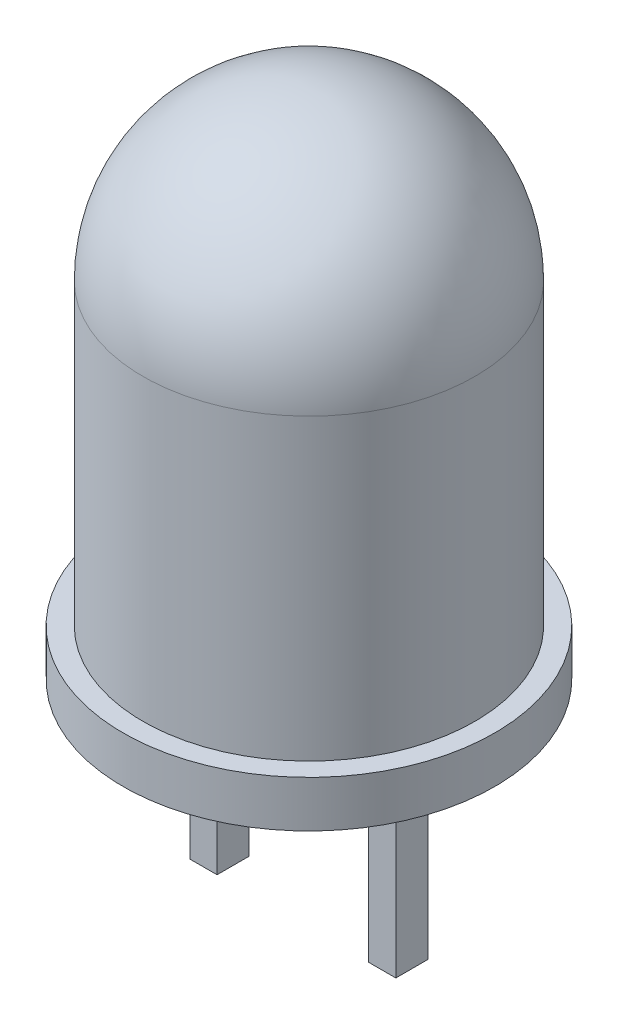
ISO-10303-21;
HEADER;
FILE_DESCRIPTION(('STEP AP214'),'2;1');
FILE_NAME('part.step','',(''),(''),'','','');
FILE_SCHEMA(('AUTOMOTIVE_DESIGN { 1 0 10303 214 1 1 1 1 }'));
ENDSEC;
DATA;
#1=APPLICATION_CONTEXT('core data for automotive mechanical design processes');
#2=APPLICATION_PROTOCOL_DEFINITION('international standard','automotive_design',2000,#1);
#3=PRODUCT_CONTEXT('',#1,'mechanical');
#4=PRODUCT('Part','Part','',(#3));
#5=PRODUCT_RELATED_PRODUCT_CATEGORY('part','',(#4));
#6=PRODUCT_DEFINITION_FORMATION('','',#4);
#7=PRODUCT_DEFINITION_CONTEXT('part definition',#1,'design');
#8=PRODUCT_DEFINITION('design','',#6,#7);
#9=PRODUCT_DEFINITION_SHAPE('','',#8);
#10=(LENGTH_UNIT() NAMED_UNIT(*) SI_UNIT(.MILLI.,.METRE.));
#11=(NAMED_UNIT(*) PLANE_ANGLE_UNIT() SI_UNIT($,.RADIAN.));
#12=(NAMED_UNIT(*) SI_UNIT($,.STERADIAN.) SOLID_ANGLE_UNIT());
#13=UNCERTAINTY_MEASURE_WITH_UNIT(LENGTH_MEASURE(1.E-05),#10,'distance_accuracy_value','');
#14=(GEOMETRIC_REPRESENTATION_CONTEXT(3) GLOBAL_UNCERTAINTY_ASSIGNED_CONTEXT((#13)) GLOBAL_UNIT_ASSIGNED_CONTEXT((#10,
#11,#12)) REPRESENTATION_CONTEXT('',''));
#15=CARTESIAN_POINT('',(0.,0.,0.));
#16=DIRECTION('',(0.,0.,1.));
#17=DIRECTION('',(1.,0.,0.));
#18=AXIS2_PLACEMENT_3D('',#15,#16,#17);
#19=CARTESIAN_POINT('',(0.,-0.7,0.));
#20=DIRECTION('',(0.,-1.,0.));
#21=DIRECTION('',(0.,0.,-1.));
#22=AXIS2_PLACEMENT_3D('',#19,#20,#21);
#23=PLANE('',#22);
#24=DIRECTION('',(-1.,0.,0.));
#25=VECTOR('',#24,1.);
#26=CARTESIAN_POINT('',(1.14190313671731,-0.7,0.242385099774928));
#27=LINE('',#26,#25);
#28=CARTESIAN_POINT('',(1.55126463855937,-0.7,0.242385099774928));
#29=VERTEX_POINT('',#28);
#30=CARTESIAN_POINT('',(1.14190313671731,-0.7,0.242385099774928));
#31=VERTEX_POINT('',#30);
#32=EDGE_CURVE('E129',#29,#31,#27,.T.);
#33=ORIENTED_EDGE('',*,*,#32,.F.);
#34=DIRECTION('',(0.,0.,1.));
#35=VECTOR('',#34,1.);
#36=CARTESIAN_POINT('',(1.55126463855937,-0.7,-0.242385099774928));
#37=LINE('',#36,#35);
#38=CARTESIAN_POINT('',(1.55126463855937,-0.7,-0.242385099774928));
#39=VERTEX_POINT('',#38);
#40=EDGE_CURVE('E126',#39,#29,#37,.T.);
#41=ORIENTED_EDGE('',*,*,#40,.F.);
#42=DIRECTION('',(1.,0.,0.));
#43=VECTOR('',#42,1.);
#44=CARTESIAN_POINT('',(1.14190313671731,-0.7,-0.242385099774928));
#45=LINE('',#44,#43);
#46=CARTESIAN_POINT('',(1.14190313671731,-0.7,-0.242385099774928));
#47=VERTEX_POINT('',#46);
#48=EDGE_CURVE('E138',#47,#39,#45,.T.);
#49=ORIENTED_EDGE('',*,*,#48,.F.);
#50=DIRECTION('',(0.,0.,-1.));
#51=VECTOR('',#50,1.);
#52=CARTESIAN_POINT('',(1.14190313671731,-0.7,-0.242385099774928));
#53=LINE('',#52,#51);
#54=EDGE_CURVE('E146',#31,#47,#53,.T.);
#55=ORIENTED_EDGE('',*,*,#54,.F.);
#56=EDGE_LOOP('',(#33,#41,#49,#55));
#57=FACE_BOUND('',#56,.T.);
#58=CARTESIAN_POINT('',(0.,-0.7,0.));
#59=DIRECTION('',(0.,-1.,0.));
#60=DIRECTION('',(0.,0.,-1.));
#61=AXIS2_PLACEMENT_3D('',#58,#59,#60);
#62=CIRCLE('',#61,2.8);
#63=CARTESIAN_POINT('',(0.,-0.7,-2.8));
#64=VERTEX_POINT('',#63);
#65=EDGE_CURVE('E158',#64,#64,#62,.T.);
#66=ORIENTED_EDGE('',*,*,#65,.T.);
#67=EDGE_LOOP('',(#66));
#68=FACE_BOUND('',#67,.T.);
#69=DIRECTION('',(-1.,0.,0.));
#70=VECTOR('',#69,1.);
#71=CARTESIAN_POINT('',(-1.14190313671731,-0.7,0.242385099774928));
#72=LINE('',#71,#70);
#73=CARTESIAN_POINT('',(-1.14190313671731,-0.7,0.242385099774928));
#74=VERTEX_POINT('',#73);
#75=CARTESIAN_POINT('',(-1.55126463855937,-0.7,0.242385099774928));
#76=VERTEX_POINT('',#75);
#77=EDGE_CURVE('E312',#74,#76,#72,.T.);
#78=ORIENTED_EDGE('',*,*,#77,.F.);
#79=DIRECTION('',(0.,0.,1.));
#80=VECTOR('',#79,1.);
#81=CARTESIAN_POINT('',(-1.14190313671731,-0.7,-0.242385099774928));
#82=LINE('',#81,#80);
#83=CARTESIAN_POINT('',(-1.14190313671731,-0.7,-0.242385099774928));
#84=VERTEX_POINT('',#83);
#85=EDGE_CURVE('E124',#84,#74,#82,.T.);
#86=ORIENTED_EDGE('',*,*,#85,.F.);
#87=DIRECTION('',(1.,0.,0.));
#88=VECTOR('',#87,1.);
#89=CARTESIAN_POINT('',(-1.14190313671731,-0.7,-0.242385099774928));
#90=LINE('',#89,#88);
#91=CARTESIAN_POINT('',(-1.55126463855937,-0.7,-0.242385099774928));
#92=VERTEX_POINT('',#91);
#93=EDGE_CURVE('E120',#92,#84,#90,.T.);
#94=ORIENTED_EDGE('',*,*,#93,.F.);
#95=DIRECTION('',(0.,0.,-1.));
#96=VECTOR('',#95,1.);
#97=CARTESIAN_POINT('',(-1.55126463855937,-0.7,-0.242385099774928));
#98=LINE('',#97,#96);
#99=EDGE_CURVE('E309',#76,#92,#98,.T.);
#100=ORIENTED_EDGE('',*,*,#99,.F.);
#101=EDGE_LOOP('',(#78,#86,#94,#100));
#102=FACE_BOUND('',#101,.T.);
#103=ADVANCED_FACE('F35',(#57,#68,#102),#23,.T.);
#104=CARTESIAN_POINT('',(0.,7.,0.));
#105=DIRECTION('',(0.,-1.,0.));
#106=DIRECTION('',(0.,0.,-1.));
#107=AXIS2_PLACEMENT_3D('',#104,#105,#106);
#108=CYLINDRICAL_SURFACE('',#107,2.5);
#109=CARTESIAN_POINT('',(0.,4.5,0.));
#110=DIRECTION('',(0.,-1.,0.));
#111=DIRECTION('',(0.,0.,-1.));
#112=AXIS2_PLACEMENT_3D('',#109,#110,#111);
#113=CIRCLE('',#112,2.5);
#114=CARTESIAN_POINT('',(0.,4.5,-2.5));
#115=VERTEX_POINT('',#114);
#116=EDGE_CURVE('E11',#115,#115,#113,.T.);
#117=ORIENTED_EDGE('',*,*,#116,.T.);
#118=EDGE_LOOP('',(#117));
#119=FACE_BOUND('',#118,.T.);
#120=CARTESIAN_POINT('',(0.,0.,0.));
#121=DIRECTION('',(0.,-1.,0.));
#122=DIRECTION('',(0.,0.,-1.));
#123=AXIS2_PLACEMENT_3D('',#120,#121,#122);
#124=CIRCLE('',#123,2.5);
#125=CARTESIAN_POINT('',(0.,0.,-2.5));
#126=VERTEX_POINT('',#125);
#127=EDGE_CURVE('E43',#126,#126,#124,.T.);
#128=ORIENTED_EDGE('',*,*,#127,.F.);
#129=EDGE_LOOP('',(#128));
#130=FACE_BOUND('',#129,.T.);
#131=ADVANCED_FACE('F167',(#119,#130),#108,.T.);
#132=CARTESIAN_POINT('',(0.,0.,0.));
#133=DIRECTION('',(0.,-1.,0.));
#134=DIRECTION('',(0.,0.,-1.));
#135=AXIS2_PLACEMENT_3D('',#132,#133,#134);
#136=PLANE('',#135);
#137=CARTESIAN_POINT('',(0.,0.,0.));
#138=DIRECTION('',(0.,-1.,0.));
#139=DIRECTION('',(0.,0.,-1.));
#140=AXIS2_PLACEMENT_3D('',#137,#138,#139);
#141=CIRCLE('',#140,2.8);
#142=CARTESIAN_POINT('',(0.,0.,-2.8));
#143=VERTEX_POINT('',#142);
#144=EDGE_CURVE('E157',#143,#143,#141,.T.);
#145=ORIENTED_EDGE('',*,*,#144,.F.);
#146=EDGE_LOOP('',(#145));
#147=FACE_BOUND('',#146,.T.);
#148=ORIENTED_EDGE('',*,*,#127,.T.);
#149=EDGE_LOOP('',(#148));
#150=FACE_BOUND('',#149,.T.);
#151=ADVANCED_FACE('F165',(#147,#150),#136,.F.);
#152=CARTESIAN_POINT('',(0.,-0.7,0.));
#153=DIRECTION('',(0.,1.,0.));
#154=DIRECTION('',(0.,0.,1.));
#155=AXIS2_PLACEMENT_3D('',#152,#153,#154);
#156=CYLINDRICAL_SURFACE('',#155,2.8);
#157=ORIENTED_EDGE('',*,*,#65,.F.);
#158=EDGE_LOOP('',(#157));
#159=FACE_BOUND('',#158,.T.);
#160=ORIENTED_EDGE('',*,*,#144,.T.);
#161=EDGE_LOOP('',(#160));
#162=FACE_BOUND('',#161,.T.);
#163=ADVANCED_FACE('F174',(#159,#162),#156,.T.);
#164=CARTESIAN_POINT('',(0.,4.5,0.));
#165=DIRECTION('',(0.,0.,1.));
#166=DIRECTION('',(1.,0.,0.));
#167=AXIS2_PLACEMENT_3D('',#164,#165,#166);
#168=SPHERICAL_SURFACE('',#167,2.5);
#169=CARTESIAN_POINT('',(0.,4.5,0.));
#170=DIRECTION('',(0.,-1.,0.));
#171=DIRECTION('',(0.,0.,-1.));
#172=AXIS2_PLACEMENT_3D('',#169,#170,#171);
#173=SPHERICAL_SURFACE('',#172,2.5);
#174=ORIENTED_EDGE('',*,*,#116,.F.);
#175=EDGE_LOOP('',(#174));
#176=FACE_BOUND('',#175,.T.);
#177=ADVANCED_FACE('F37',(#176),#173,.T.);
#178=CARTESIAN_POINT('',(1.55126463855937,-3.7,-0.242385099774928));
#179=DIRECTION('',(-1.,0.,0.));
#180=DIRECTION('',(0.,0.,1.));
#181=AXIS2_PLACEMENT_3D('',#178,#179,#180);
#182=PLANE('',#181);
#183=ORIENTED_EDGE('',*,*,#40,.T.);
#184=DIRECTION('',(0.,1.,0.));
#185=VECTOR('',#184,1.);
#186=CARTESIAN_POINT('',(1.55126463855937,-3.7,0.242385099774928));
#187=LINE('',#186,#185);
#188=CARTESIAN_POINT('',(1.55126463855937,-3.7,0.242385099774928));
#189=VERTEX_POINT('',#188);
#190=EDGE_CURVE('E155',#189,#29,#187,.T.);
#191=ORIENTED_EDGE('',*,*,#190,.F.);
#192=DIRECTION('',(0.,0.,1.));
#193=VECTOR('',#192,1.);
#194=CARTESIAN_POINT('',(1.55126463855937,-3.7,-0.242385099774928));
#195=LINE('',#194,#193);
#196=CARTESIAN_POINT('',(1.55126463855937,-3.7,-0.242385099774928));
#197=VERTEX_POINT('',#196);
#198=EDGE_CURVE('E134',#197,#189,#195,.T.);
#199=ORIENTED_EDGE('',*,*,#198,.F.);
#200=DIRECTION('',(0.,1.,0.));
#201=VECTOR('',#200,1.);
#202=CARTESIAN_POINT('',(1.55126463855937,-3.7,-0.242385099774928));
#203=LINE('',#202,#201);
#204=EDGE_CURVE('E143',#197,#39,#203,.T.);
#205=ORIENTED_EDGE('',*,*,#204,.T.);
#206=EDGE_LOOP('',(#183,#191,#199,#205));
#207=FACE_BOUND('',#206,.T.);
#208=ADVANCED_FACE('F183',(#207),#182,.F.);
#209=CARTESIAN_POINT('',(1.14190313671731,-3.7,0.242385099774928));
#210=DIRECTION('',(0.,0.,-1.));
#211=DIRECTION('',(-1.,0.,0.));
#212=AXIS2_PLACEMENT_3D('',#209,#210,#211);
#213=PLANE('',#212);
#214=ORIENTED_EDGE('',*,*,#32,.T.);
#215=DIRECTION('',(0.,1.,0.));
#216=VECTOR('',#215,1.);
#217=CARTESIAN_POINT('',(1.14190313671731,-3.7,0.242385099774928));
#218=LINE('',#217,#216);
#219=CARTESIAN_POINT('',(1.14190313671731,-3.7,0.242385099774928));
#220=VERTEX_POINT('',#219);
#221=EDGE_CURVE('E152',#220,#31,#218,.T.);
#222=ORIENTED_EDGE('',*,*,#221,.F.);
#223=DIRECTION('',(-1.,0.,0.));
#224=VECTOR('',#223,1.);
#225=CARTESIAN_POINT('',(1.14190313671731,-3.7,0.242385099774928));
#226=LINE('',#225,#224);
#227=EDGE_CURVE('E137',#189,#220,#226,.T.);
#228=ORIENTED_EDGE('',*,*,#227,.F.);
#229=ORIENTED_EDGE('',*,*,#190,.T.);
#230=EDGE_LOOP('',(#214,#222,#228,#229));
#231=FACE_BOUND('',#230,.T.);
#232=ADVANCED_FACE('F186',(#231),#213,.F.);
#233=CARTESIAN_POINT('',(1.14190313671731,-3.7,-0.242385099774928));
#234=DIRECTION('',(1.,0.,0.));
#235=DIRECTION('',(0.,0.,-1.));
#236=AXIS2_PLACEMENT_3D('',#233,#234,#235);
#237=PLANE('',#236);
#238=ORIENTED_EDGE('',*,*,#54,.T.);
#239=DIRECTION('',(0.,1.,0.));
#240=VECTOR('',#239,1.);
#241=CARTESIAN_POINT('',(1.14190313671731,-3.7,-0.242385099774928));
#242=LINE('',#241,#240);
#243=CARTESIAN_POINT('',(1.14190313671731,-3.7,-0.242385099774928));
#244=VERTEX_POINT('',#243);
#245=EDGE_CURVE('E58',#244,#47,#242,.T.);
#246=ORIENTED_EDGE('',*,*,#245,.F.);
#247=DIRECTION('',(0.,0.,-1.));
#248=VECTOR('',#247,1.);
#249=CARTESIAN_POINT('',(1.14190313671731,-3.7,-0.242385099774928));
#250=LINE('',#249,#248);
#251=EDGE_CURVE('E140',#220,#244,#250,.T.);
#252=ORIENTED_EDGE('',*,*,#251,.F.);
#253=ORIENTED_EDGE('',*,*,#221,.T.);
#254=EDGE_LOOP('',(#238,#246,#252,#253));
#255=FACE_BOUND('',#254,.T.);
#256=ADVANCED_FACE('F190',(#255),#237,.F.);
#257=CARTESIAN_POINT('',(1.14190313671731,-3.7,-0.242385099774928));
#258=DIRECTION('',(0.,0.,1.));
#259=DIRECTION('',(1.,0.,0.));
#260=AXIS2_PLACEMENT_3D('',#257,#258,#259);
#261=PLANE('',#260);
#262=ORIENTED_EDGE('',*,*,#48,.T.);
#263=ORIENTED_EDGE('',*,*,#204,.F.);
#264=DIRECTION('',(1.,0.,0.));
#265=VECTOR('',#264,1.);
#266=CARTESIAN_POINT('',(1.14190313671731,-3.7,-0.242385099774928));
#267=LINE('',#266,#265);
#268=EDGE_CURVE('E142',#244,#197,#267,.T.);
#269=ORIENTED_EDGE('',*,*,#268,.F.);
#270=ORIENTED_EDGE('',*,*,#245,.T.);
#271=EDGE_LOOP('',(#262,#263,#269,#270));
#272=FACE_BOUND('',#271,.T.);
#273=ADVANCED_FACE('F194',(#272),#261,.F.);
#274=CARTESIAN_POINT('',(1.55126463855937,-3.7,0.242385099774928));
#275=DIRECTION('',(0.,1.,0.));
#276=DIRECTION('',(0.,0.,1.));
#277=AXIS2_PLACEMENT_3D('',#274,#275,#276);
#278=PLANE('',#277);
#279=ORIENTED_EDGE('',*,*,#198,.T.);
#280=ORIENTED_EDGE('',*,*,#227,.T.);
#281=ORIENTED_EDGE('',*,*,#251,.T.);
#282=ORIENTED_EDGE('',*,*,#268,.T.);
#283=EDGE_LOOP('',(#279,#280,#281,#282));
#284=FACE_BOUND('',#283,.T.);
#285=ADVANCED_FACE('F198',(#284),#278,.F.);
#286=CARTESIAN_POINT('',(-1.14190313671731,-3.7,-0.242385099774928));
#287=DIRECTION('',(-1.,0.,0.));
#288=DIRECTION('',(0.,0.,1.));
#289=AXIS2_PLACEMENT_3D('',#286,#287,#288);
#290=PLANE('',#289);
#291=ORIENTED_EDGE('',*,*,#85,.T.);
#292=DIRECTION('',(0.,1.,0.));
#293=VECTOR('',#292,1.);
#294=CARTESIAN_POINT('',(-1.14190313671731,-3.7,0.242385099774928));
#295=LINE('',#294,#293);
#296=CARTESIAN_POINT('',(-1.14190313671731,-3.7,0.242385099774928));
#297=VERTEX_POINT('',#296);
#298=EDGE_CURVE('E105',#297,#74,#295,.T.);
#299=ORIENTED_EDGE('',*,*,#298,.F.);
#300=DIRECTION('',(0.,0.,1.));
#301=VECTOR('',#300,1.);
#302=CARTESIAN_POINT('',(-1.14190313671731,-3.7,-0.242385099774928));
#303=LINE('',#302,#301);
#304=CARTESIAN_POINT('',(-1.14190313671731,-3.7,-0.242385099774928));
#305=VERTEX_POINT('',#304);
#306=EDGE_CURVE('E112',#305,#297,#303,.T.);
#307=ORIENTED_EDGE('',*,*,#306,.F.);
#308=DIRECTION('',(0.,1.,0.));
#309=VECTOR('',#308,1.);
#310=CARTESIAN_POINT('',(-1.14190313671731,-3.7,-0.242385099774928));
#311=LINE('',#310,#309);
#312=EDGE_CURVE('E306',#305,#84,#311,.T.);
#313=ORIENTED_EDGE('',*,*,#312,.T.);
#314=EDGE_LOOP('',(#291,#299,#307,#313));
#315=FACE_BOUND('',#314,.T.);
#316=ADVANCED_FACE('F122',(#315),#290,.F.);
#317=CARTESIAN_POINT('',(-1.14190313671731,-3.7,0.242385099774928));
#318=DIRECTION('',(0.,0.,-1.));
#319=DIRECTION('',(-1.,0.,0.));
#320=AXIS2_PLACEMENT_3D('',#317,#318,#319);
#321=PLANE('',#320);
#322=ORIENTED_EDGE('',*,*,#77,.T.);
#323=DIRECTION('',(0.,1.,0.));
#324=VECTOR('',#323,1.);
#325=CARTESIAN_POINT('',(-1.55126463855937,-3.7,0.242385099774928));
#326=LINE('',#325,#324);
#327=CARTESIAN_POINT('',(-1.55126463855937,-3.7,0.242385099774928));
#328=VERTEX_POINT('',#327);
#329=EDGE_CURVE('E108',#328,#76,#326,.T.);
#330=ORIENTED_EDGE('',*,*,#329,.F.);
#331=DIRECTION('',(-1.,0.,0.));
#332=VECTOR('',#331,1.);
#333=CARTESIAN_POINT('',(-1.14190313671731,-3.7,0.242385099774928));
#334=LINE('',#333,#332);
#335=EDGE_CURVE('E101',#297,#328,#334,.T.);
#336=ORIENTED_EDGE('',*,*,#335,.F.);
#337=ORIENTED_EDGE('',*,*,#298,.T.);
#338=EDGE_LOOP('',(#322,#330,#336,#337));
#339=FACE_BOUND('',#338,.T.);
#340=ADVANCED_FACE('F103',(#339),#321,.F.);
#341=CARTESIAN_POINT('',(-1.55126463855937,-3.7,-0.242385099774928));
#342=DIRECTION('',(1.,0.,0.));
#343=DIRECTION('',(0.,0.,-1.));
#344=AXIS2_PLACEMENT_3D('',#341,#342,#343);
#345=PLANE('',#344);
#346=ORIENTED_EDGE('',*,*,#99,.T.);
#347=DIRECTION('',(0.,1.,0.));
#348=VECTOR('',#347,1.);
#349=CARTESIAN_POINT('',(-1.55126463855937,-3.7,-0.242385099774928));
#350=LINE('',#349,#348);
#351=CARTESIAN_POINT('',(-1.55126463855937,-3.7,-0.242385099774928));
#352=VERTEX_POINT('',#351);
#353=EDGE_CURVE('E50',#352,#92,#350,.T.);
#354=ORIENTED_EDGE('',*,*,#353,.F.);
#355=DIRECTION('',(0.,0.,-1.));
#356=VECTOR('',#355,1.);
#357=CARTESIAN_POINT('',(-1.55126463855937,-3.7,-0.242385099774928));
#358=LINE('',#357,#356);
#359=EDGE_CURVE('E111',#328,#352,#358,.T.);
#360=ORIENTED_EDGE('',*,*,#359,.F.);
#361=ORIENTED_EDGE('',*,*,#329,.T.);
#362=EDGE_LOOP('',(#346,#354,#360,#361));
#363=FACE_BOUND('',#362,.T.);
#364=ADVANCED_FACE('F206',(#363),#345,.F.);
#365=CARTESIAN_POINT('',(-1.14190313671731,-3.7,-0.242385099774928));
#366=DIRECTION('',(0.,0.,1.));
#367=DIRECTION('',(1.,0.,0.));
#368=AXIS2_PLACEMENT_3D('',#365,#366,#367);
#369=PLANE('',#368);
#370=ORIENTED_EDGE('',*,*,#93,.T.);
#371=ORIENTED_EDGE('',*,*,#312,.F.);
#372=DIRECTION('',(1.,0.,0.));
#373=VECTOR('',#372,1.);
#374=CARTESIAN_POINT('',(-1.14190313671731,-3.7,-0.242385099774928));
#375=LINE('',#374,#373);
#376=EDGE_CURVE('E116',#352,#305,#375,.T.);
#377=ORIENTED_EDGE('',*,*,#376,.F.);
#378=ORIENTED_EDGE('',*,*,#353,.T.);
#379=EDGE_LOOP('',(#370,#371,#377,#378));
#380=FACE_BOUND('',#379,.T.);
#381=ADVANCED_FACE('F209',(#380),#369,.F.);
#382=CARTESIAN_POINT('',(-1.14190313671731,-3.7,0.242385099774928));
#383=DIRECTION('',(0.,-1.,0.));
#384=DIRECTION('',(0.,0.,-1.));
#385=AXIS2_PLACEMENT_3D('',#382,#383,#384);
#386=PLANE('',#385);
#387=ORIENTED_EDGE('',*,*,#306,.T.);
#388=ORIENTED_EDGE('',*,*,#335,.T.);
#389=ORIENTED_EDGE('',*,*,#359,.T.);
#390=ORIENTED_EDGE('',*,*,#376,.T.);
#391=EDGE_LOOP('',(#387,#388,#389,#390));
#392=FACE_BOUND('',#391,.T.);
#393=ADVANCED_FACE('F115',(#392),#386,.T.);
#394=CLOSED_SHELL('',(#103,#131,#151,#163,#177,#208,#232,#256,#273,#285,#316,#340,#364,#381,#393));
#395=MANIFOLD_SOLID_BREP('B2',#394);
#396=ADVANCED_BREP_SHAPE_REPRESENTATION('',(#18,#395),#14);
#397=SHAPE_DEFINITION_REPRESENTATION(#9,#396);
ENDSEC;
END-ISO-10303-21;
